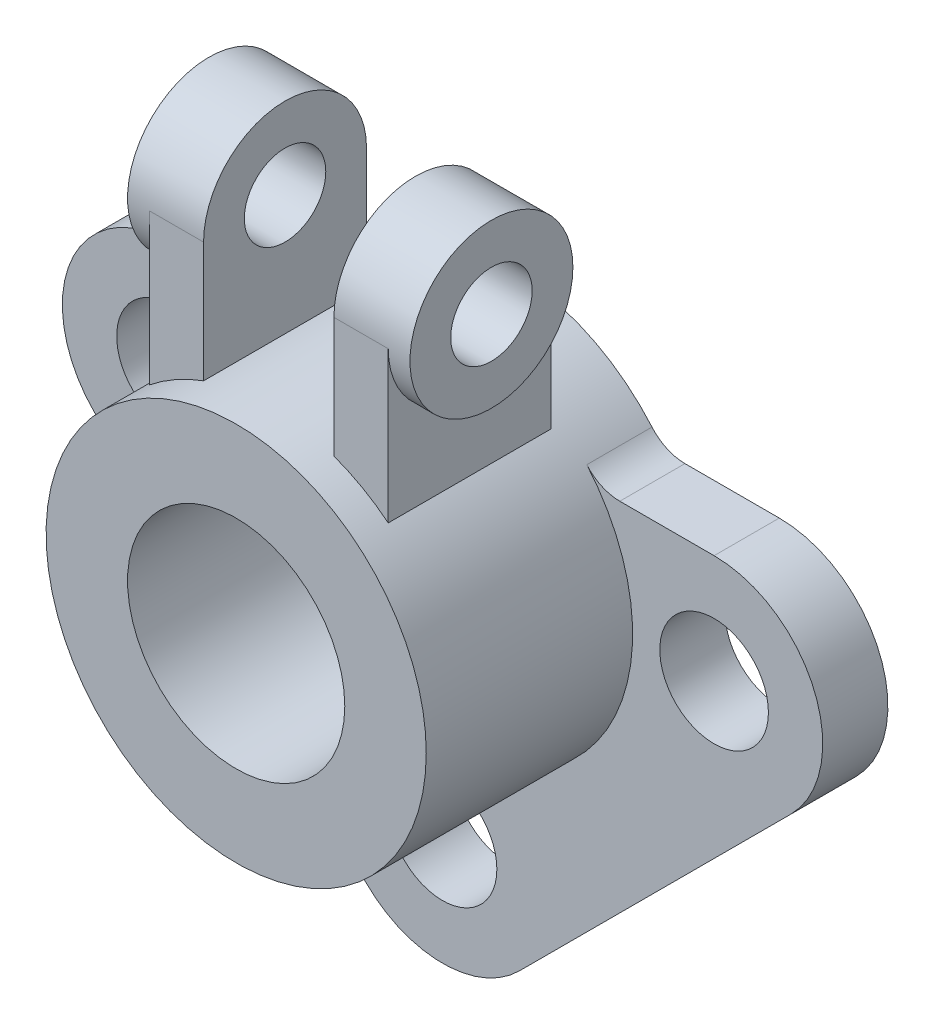
ISO-10303-21;
HEADER;
FILE_DESCRIPTION(('STEP AP214'),'2;1');
FILE_NAME('part.step','',(''),(''),'','','');
FILE_SCHEMA(('AUTOMOTIVE_DESIGN { 1 0 10303 214 1 1 1 1 }'));
ENDSEC;
DATA;
#1=APPLICATION_CONTEXT('core data for automotive mechanical design processes');
#2=APPLICATION_PROTOCOL_DEFINITION('international standard','automotive_design',2000,#1);
#3=PRODUCT_CONTEXT('',#1,'mechanical');
#4=PRODUCT('Part','Part','',(#3));
#5=PRODUCT_RELATED_PRODUCT_CATEGORY('part','',(#4));
#6=PRODUCT_DEFINITION_FORMATION('','',#4);
#7=PRODUCT_DEFINITION_CONTEXT('part definition',#1,'design');
#8=PRODUCT_DEFINITION('design','',#6,#7);
#9=PRODUCT_DEFINITION_SHAPE('','',#8);
#10=(LENGTH_UNIT() NAMED_UNIT(*) SI_UNIT(.MILLI.,.METRE.));
#11=(NAMED_UNIT(*) PLANE_ANGLE_UNIT() SI_UNIT($,.RADIAN.));
#12=(NAMED_UNIT(*) SI_UNIT($,.STERADIAN.) SOLID_ANGLE_UNIT());
#13=UNCERTAINTY_MEASURE_WITH_UNIT(LENGTH_MEASURE(1.E-05),#10,'distance_accuracy_value','');
#14=(GEOMETRIC_REPRESENTATION_CONTEXT(3) GLOBAL_UNCERTAINTY_ASSIGNED_CONTEXT((#13)) GLOBAL_UNIT_ASSIGNED_CONTEXT((#10,
#11,#12)) REPRESENTATION_CONTEXT('',''));
#15=CARTESIAN_POINT('',(0.,0.,0.));
#16=DIRECTION('',(0.,0.,1.));
#17=DIRECTION('',(1.,0.,0.));
#18=AXIS2_PLACEMENT_3D('',#15,#16,#17);
#19=CARTESIAN_POINT('',(0.,0.,50.));
#20=DIRECTION('',(0.,0.,-1.));
#21=DIRECTION('',(-1.,0.,0.));
#22=AXIS2_PLACEMENT_3D('',#19,#20,#21);
#23=CYLINDRICAL_SURFACE('',#22,35.);
#24=CARTESIAN_POINT('',(0.,0.,50.));
#25=DIRECTION('',(0.,0.,1.));
#26=DIRECTION('',(1.,0.,0.));
#27=AXIS2_PLACEMENT_3D('',#24,#25,#26);
#28=CIRCLE('',#27,35.);
#29=CARTESIAN_POINT('',(35.,0.,50.));
#30=VERTEX_POINT('',#29);
#31=EDGE_CURVE('E265',#30,#30,#28,.T.);
#32=ORIENTED_EDGE('',*,*,#31,.F.);
#33=EDGE_LOOP('',(#32));
#34=FACE_BOUND('',#33,.T.);
#35=CARTESIAN_POINT('',(0.,0.,0.));
#36=DIRECTION('',(0.,0.,1.));
#37=DIRECTION('',(1.,0.,0.));
#38=AXIS2_PLACEMENT_3D('',#35,#36,#37);
#39=CIRCLE('',#38,35.);
#40=CARTESIAN_POINT('',(26.5628330475733,22.7906976744186,0.));
#41=VERTEX_POINT('',#40);
#42=CARTESIAN_POINT('',(-26.5628330475733,22.7906976744186,0.));
#43=VERTEX_POINT('',#42);
#44=EDGE_CURVE('E266',#41,#43,#39,.T.);
#45=ORIENTED_EDGE('',*,*,#44,.T.);
#46=DIRECTION('',(0.,0.,-1.));
#47=VECTOR('',#46,1.);
#48=CARTESIAN_POINT('',(-26.5628330475733,22.7906976744186,50.));
#49=LINE('',#48,#47);
#50=CARTESIAN_POINT('',(-26.5628330475733,22.7906976744186,12.));
#51=VERTEX_POINT('',#50);
#52=EDGE_CURVE('E398',#43,#51,#49,.F.);
#53=ORIENTED_EDGE('',*,*,#52,.T.);
#54=CARTESIAN_POINT('',(0.,0.,12.));
#55=DIRECTION('',(0.,0.,1.));
#56=DIRECTION('',(1.,0.,0.));
#57=AXIS2_PLACEMENT_3D('',#54,#55,#56);
#58=CIRCLE('',#57,35.);
#59=CARTESIAN_POINT('',(26.5628330475733,22.7906976744186,12.));
#60=VERTEX_POINT('',#59);
#61=EDGE_CURVE('E297',#51,#60,#58,.T.);
#62=ORIENTED_EDGE('',*,*,#61,.T.);
#63=DIRECTION('',(0.,0.,-1.));
#64=VECTOR('',#63,1.);
#65=CARTESIAN_POINT('',(26.5628330475733,22.7906976744186,50.));
#66=LINE('',#65,#64);
#67=EDGE_CURVE('E394',#60,#41,#66,.T.);
#68=ORIENTED_EDGE('',*,*,#67,.T.);
#69=EDGE_LOOP('',(#45,#53,#62,#68));
#70=FACE_BOUND('',#69,.T.);
#71=CARTESIAN_POINT('',(0.,0.,14.));
#72=DIRECTION('',(0.,0.,1.));
#73=DIRECTION('',(1.,0.,0.));
#74=AXIS2_PLACEMENT_3D('',#71,#72,#73);
#75=CIRCLE('',#74,35.);
#76=CARTESIAN_POINT('',(22.,27.2213151776324,14.));
#77=VERTEX_POINT('',#76);
#78=CARTESIAN_POINT('',(12.,32.8785644455472,14.));
#79=VERTEX_POINT('',#78);
#80=EDGE_CURVE('E379',#77,#79,#75,.T.);
#81=ORIENTED_EDGE('',*,*,#80,.F.);
#82=DIRECTION('',(0.,0.,-1.));
#83=VECTOR('',#82,1.);
#84=CARTESIAN_POINT('',(22.,27.2213151776324,50.));
#85=LINE('',#84,#83);
#86=CARTESIAN_POINT('',(22.,27.2213151776324,44.));
#87=VERTEX_POINT('',#86);
#88=EDGE_CURVE('E387',#77,#87,#85,.F.);
#89=ORIENTED_EDGE('',*,*,#88,.T.);
#90=CARTESIAN_POINT('',(0.,0.,44.));
#91=DIRECTION('',(0.,0.,-1.));
#92=DIRECTION('',(-1.,0.,0.));
#93=AXIS2_PLACEMENT_3D('',#90,#91,#92);
#94=CIRCLE('',#93,35.);
#95=CARTESIAN_POINT('',(12.,32.8785644455472,44.));
#96=VERTEX_POINT('',#95);
#97=EDGE_CURVE('E383',#96,#87,#94,.T.);
#98=ORIENTED_EDGE('',*,*,#97,.F.);
#99=DIRECTION('',(0.,0.,-1.));
#100=VECTOR('',#99,1.);
#101=CARTESIAN_POINT('',(12.,32.8785644455472,50.));
#102=LINE('',#101,#100);
#103=EDGE_CURVE('E375',#79,#96,#102,.F.);
#104=ORIENTED_EDGE('',*,*,#103,.F.);
#105=EDGE_LOOP('',(#81,#89,#98,#104));
#106=FACE_BOUND('',#105,.T.);
#107=CARTESIAN_POINT('',(0.,0.,44.));
#108=DIRECTION('',(0.,0.,1.));
#109=DIRECTION('',(1.,0.,0.));
#110=AXIS2_PLACEMENT_3D('',#107,#108,#109);
#111=CIRCLE('',#110,35.);
#112=CARTESIAN_POINT('',(-12.,32.8785644455472,44.));
#113=VERTEX_POINT('',#112);
#114=CARTESIAN_POINT('',(-22.,27.2213151776324,44.));
#115=VERTEX_POINT('',#114);
#116=EDGE_CURVE('E211',#113,#115,#111,.T.);
#117=ORIENTED_EDGE('',*,*,#116,.T.);
#118=DIRECTION('',(0.,0.,-1.));
#119=VECTOR('',#118,1.);
#120=CARTESIAN_POINT('',(-22.,27.2213151776324,50.));
#121=LINE('',#120,#119);
#122=CARTESIAN_POINT('',(-22.,27.2213151776324,14.));
#123=VERTEX_POINT('',#122);
#124=EDGE_CURVE('E214',#123,#115,#121,.F.);
#125=ORIENTED_EDGE('',*,*,#124,.F.);
#126=CARTESIAN_POINT('',(0.,0.,14.));
#127=DIRECTION('',(0.,0.,-1.));
#128=DIRECTION('',(-1.,0.,0.));
#129=AXIS2_PLACEMENT_3D('',#126,#127,#128);
#130=CIRCLE('',#129,35.);
#131=CARTESIAN_POINT('',(-12.,32.8785644455472,14.));
#132=VERTEX_POINT('',#131);
#133=EDGE_CURVE('E208',#123,#132,#130,.T.);
#134=ORIENTED_EDGE('',*,*,#133,.T.);
#135=DIRECTION('',(0.,0.,-1.));
#136=VECTOR('',#135,1.);
#137=CARTESIAN_POINT('',(-12.,32.8785644455472,50.));
#138=LINE('',#137,#136);
#139=EDGE_CURVE('E192',#132,#113,#138,.F.);
#140=ORIENTED_EDGE('',*,*,#139,.T.);
#141=EDGE_LOOP('',(#117,#125,#134,#140));
#142=FACE_BOUND('',#141,.T.);
#143=ADVANCED_FACE('F40',(#34,#70,#106,#142),#23,.T.);
#144=CARTESIAN_POINT('',(0.,-50.,12.));
#145=DIRECTION('',(0.,0.,-1.));
#146=DIRECTION('',(-1.,0.,0.));
#147=AXIS2_PLACEMENT_3D('',#144,#145,#146);
#148=CYLINDRICAL_SURFACE('',#147,20.);
#149=CARTESIAN_POINT('',(0.,-50.,0.));
#150=DIRECTION('',(0.,0.,1.));
#151=DIRECTION('',(1.,0.,0.));
#152=AXIS2_PLACEMENT_3D('',#149,#150,#151);
#153=CIRCLE('',#152,20.);
#154=CARTESIAN_POINT('',(14.142135623731,-64.142135623731,0.));
#155=VERTEX_POINT('',#154);
#156=CARTESIAN_POINT('',(-14.142135623731,-64.142135623731,0.));
#157=VERTEX_POINT('',#156);
#158=EDGE_CURVE('E322',#155,#157,#153,.F.);
#159=ORIENTED_EDGE('',*,*,#158,.F.);
#160=DIRECTION('',(0.,0.,-1.));
#161=VECTOR('',#160,1.);
#162=CARTESIAN_POINT('',(14.142135623731,-64.142135623731,12.));
#163=LINE('',#162,#161);
#164=CARTESIAN_POINT('',(14.142135623731,-64.142135623731,12.));
#165=VERTEX_POINT('',#164);
#166=EDGE_CURVE('E372',#165,#155,#163,.T.);
#167=ORIENTED_EDGE('',*,*,#166,.F.);
#168=CARTESIAN_POINT('',(0.,-50.,12.));
#169=DIRECTION('',(0.,0.,1.));
#170=DIRECTION('',(1.,0.,0.));
#171=AXIS2_PLACEMENT_3D('',#168,#169,#170);
#172=CIRCLE('',#171,20.);
#173=CARTESIAN_POINT('',(-14.142135623731,-64.142135623731,12.));
#174=VERTEX_POINT('',#173);
#175=EDGE_CURVE('E281',#165,#174,#172,.F.);
#176=ORIENTED_EDGE('',*,*,#175,.T.);
#177=DIRECTION('',(0.,0.,-1.));
#178=VECTOR('',#177,1.);
#179=CARTESIAN_POINT('',(-14.142135623731,-64.142135623731,12.));
#180=LINE('',#179,#178);
#181=EDGE_CURVE('E318',#174,#157,#180,.T.);
#182=ORIENTED_EDGE('',*,*,#181,.T.);
#183=EDGE_LOOP('',(#159,#167,#176,#182));
#184=FACE_BOUND('',#183,.T.);
#185=ADVANCED_FACE('F451',(#184),#148,.T.);
#186=CARTESIAN_POINT('',(39.142135623731,-39.1421356237309,12.));
#187=DIRECTION('',(0.707106781186548,-0.707106781186547,0.));
#188=DIRECTION('',(0.707106781186547,0.707106781186548,0.));
#189=AXIS2_PLACEMENT_3D('',#186,#187,#188);
#190=PLANE('',#189);
#191=DIRECTION('',(-0.707106781186547,-0.707106781186548,0.));
#192=VECTOR('',#191,1.);
#193=CARTESIAN_POINT('',(39.142135623731,-39.1421356237309,0.));
#194=LINE('',#193,#192);
#195=CARTESIAN_POINT('',(64.1421356237309,-14.1421356237309,0.));
#196=VERTEX_POINT('',#195);
#197=EDGE_CURVE('E326',#196,#155,#194,.T.);
#198=ORIENTED_EDGE('',*,*,#197,.F.);
#199=DIRECTION('',(0.,0.,-1.));
#200=VECTOR('',#199,1.);
#201=CARTESIAN_POINT('',(64.1421356237309,-14.1421356237309,12.));
#202=LINE('',#201,#200);
#203=CARTESIAN_POINT('',(64.1421356237309,-14.1421356237309,12.));
#204=VERTEX_POINT('',#203);
#205=EDGE_CURVE('E369',#204,#196,#202,.T.);
#206=ORIENTED_EDGE('',*,*,#205,.F.);
#207=DIRECTION('',(-0.707106781186547,-0.707106781186548,0.));
#208=VECTOR('',#207,1.);
#209=CARTESIAN_POINT('',(39.142135623731,-39.1421356237309,12.));
#210=LINE('',#209,#208);
#211=EDGE_CURVE('E286',#204,#165,#210,.T.);
#212=ORIENTED_EDGE('',*,*,#211,.T.);
#213=ORIENTED_EDGE('',*,*,#166,.T.);
#214=EDGE_LOOP('',(#198,#206,#212,#213));
#215=FACE_BOUND('',#214,.T.);
#216=ADVANCED_FACE('F459',(#215),#190,.T.);
#217=CARTESIAN_POINT('',(50.,0.,12.));
#218=DIRECTION('',(0.,0.,-1.));
#219=DIRECTION('',(-1.,0.,0.));
#220=AXIS2_PLACEMENT_3D('',#217,#218,#219);
#221=CYLINDRICAL_SURFACE('',#220,20.);
#222=CARTESIAN_POINT('',(50.,0.,0.));
#223=DIRECTION('',(0.,0.,1.));
#224=DIRECTION('',(1.,0.,0.));
#225=AXIS2_PLACEMENT_3D('',#222,#223,#224);
#226=CIRCLE('',#225,20.);
#227=CARTESIAN_POINT('',(50.,20.,0.));
#228=VERTEX_POINT('',#227);
#229=EDGE_CURVE('E330',#228,#196,#226,.F.);
#230=ORIENTED_EDGE('',*,*,#229,.F.);
#231=DIRECTION('',(0.,0.,-1.));
#232=VECTOR('',#231,1.);
#233=CARTESIAN_POINT('',(50.,20.,12.));
#234=LINE('',#233,#232);
#235=CARTESIAN_POINT('',(50.,20.,12.));
#236=VERTEX_POINT('',#235);
#237=EDGE_CURVE('E365',#236,#228,#234,.T.);
#238=ORIENTED_EDGE('',*,*,#237,.F.);
#239=CARTESIAN_POINT('',(50.,0.,12.));
#240=DIRECTION('',(0.,0.,1.));
#241=DIRECTION('',(1.,0.,0.));
#242=AXIS2_PLACEMENT_3D('',#239,#240,#241);
#243=CIRCLE('',#242,20.);
#244=EDGE_CURVE('E290',#236,#204,#243,.F.);
#245=ORIENTED_EDGE('',*,*,#244,.T.);
#246=ORIENTED_EDGE('',*,*,#205,.T.);
#247=EDGE_LOOP('',(#230,#238,#245,#246));
#248=FACE_BOUND('',#247,.T.);
#249=ADVANCED_FACE('F503',(#248),#221,.T.);
#250=CARTESIAN_POINT('',(0.,20.,12.));
#251=DIRECTION('',(0.,1.,0.));
#252=DIRECTION('',(0.,0.,1.));
#253=AXIS2_PLACEMENT_3D('',#250,#251,#252);
#254=PLANE('',#253);
#255=DIRECTION('',(1.,0.,0.));
#256=VECTOR('',#255,1.);
#257=CARTESIAN_POINT('',(0.,20.,0.));
#258=LINE('',#257,#256);
#259=CARTESIAN_POINT('',(32.6343377441614,20.,0.));
#260=VERTEX_POINT('',#259);
#261=EDGE_CURVE('E334',#260,#228,#258,.T.);
#262=ORIENTED_EDGE('',*,*,#261,.F.);
#263=DIRECTION('',(0.,0.,-1.));
#264=VECTOR('',#263,1.);
#265=CARTESIAN_POINT('',(32.6343377441614,20.,12.));
#266=LINE('',#265,#264);
#267=CARTESIAN_POINT('',(32.6343377441614,20.,12.));
#268=VERTEX_POINT('',#267);
#269=EDGE_CURVE('E56',#260,#268,#266,.F.);
#270=ORIENTED_EDGE('',*,*,#269,.T.);
#271=DIRECTION('',(1.,0.,0.));
#272=VECTOR('',#271,1.);
#273=CARTESIAN_POINT('',(0.,20.,12.));
#274=LINE('',#273,#272);
#275=EDGE_CURVE('E294',#268,#236,#274,.T.);
#276=ORIENTED_EDGE('',*,*,#275,.T.);
#277=ORIENTED_EDGE('',*,*,#237,.T.);
#278=EDGE_LOOP('',(#262,#270,#276,#277));
#279=FACE_BOUND('',#278,.T.);
#280=ADVANCED_FACE('F500',(#279),#254,.T.);
#281=CARTESIAN_POINT('',(0.,20.,12.));
#282=DIRECTION('',(0.,-1.,0.));
#283=DIRECTION('',(1.,0.,0.));
#284=AXIS2_PLACEMENT_3D('',#281,#282,#283);
#285=PLANE('',#284);
#286=DIRECTION('',(-1.,0.,0.));
#287=VECTOR('',#286,1.);
#288=CARTESIAN_POINT('',(0.,20.,12.));
#289=LINE('',#288,#287);
#290=CARTESIAN_POINT('',(-32.6343377441614,20.,12.));
#291=VERTEX_POINT('',#290);
#292=CARTESIAN_POINT('',(-50.,20.,12.));
#293=VERTEX_POINT('',#292);
#294=EDGE_CURVE('E300',#291,#293,#289,.T.);
#295=ORIENTED_EDGE('',*,*,#294,.F.);
#296=DIRECTION('',(0.,0.,1.));
#297=VECTOR('',#296,1.);
#298=CARTESIAN_POINT('',(-32.6343377441614,20.,0.));
#299=LINE('',#298,#297);
#300=CARTESIAN_POINT('',(-32.6343377441614,20.,0.));
#301=VERTEX_POINT('',#300);
#302=EDGE_CURVE('E390',#291,#301,#299,.F.);
#303=ORIENTED_EDGE('',*,*,#302,.T.);
#304=DIRECTION('',(-1.,0.,0.));
#305=VECTOR('',#304,1.);
#306=CARTESIAN_POINT('',(0.,20.,0.));
#307=LINE('',#306,#305);
#308=CARTESIAN_POINT('',(-50.,20.,0.));
#309=VERTEX_POINT('',#308);
#310=EDGE_CURVE('E337',#301,#309,#307,.T.);
#311=ORIENTED_EDGE('',*,*,#310,.T.);
#312=DIRECTION('',(0.,0.,-1.));
#313=VECTOR('',#312,1.);
#314=CARTESIAN_POINT('',(-50.,20.,12.));
#315=LINE('',#314,#313);
#316=EDGE_CURVE('E361',#293,#309,#315,.T.);
#317=ORIENTED_EDGE('',*,*,#316,.F.);
#318=EDGE_LOOP('',(#295,#303,#311,#317));
#319=FACE_BOUND('',#318,.T.);
#320=ADVANCED_FACE('F496',(#319),#285,.F.);
#321=CARTESIAN_POINT('',(-50.,0.,12.));
#322=DIRECTION('',(0.,0.,-1.));
#323=DIRECTION('',(-1.,0.,0.));
#324=AXIS2_PLACEMENT_3D('',#321,#322,#323);
#325=CYLINDRICAL_SURFACE('',#324,20.);
#326=CARTESIAN_POINT('',(-50.,0.,0.));
#327=DIRECTION('',(0.,0.,1.));
#328=DIRECTION('',(1.,0.,0.));
#329=AXIS2_PLACEMENT_3D('',#326,#327,#328);
#330=CIRCLE('',#329,20.);
#331=CARTESIAN_POINT('',(-64.1421356237309,-14.1421356237309,0.));
#332=VERTEX_POINT('',#331);
#333=EDGE_CURVE('E340',#309,#332,#330,.T.);
#334=ORIENTED_EDGE('',*,*,#333,.T.);
#335=DIRECTION('',(0.,0.,-1.));
#336=VECTOR('',#335,1.);
#337=CARTESIAN_POINT('',(-64.1421356237309,-14.1421356237309,12.));
#338=LINE('',#337,#336);
#339=CARTESIAN_POINT('',(-64.1421356237309,-14.1421356237309,12.));
#340=VERTEX_POINT('',#339);
#341=EDGE_CURVE('E357',#340,#332,#338,.T.);
#342=ORIENTED_EDGE('',*,*,#341,.F.);
#343=CARTESIAN_POINT('',(-50.,0.,12.));
#344=DIRECTION('',(0.,0.,1.));
#345=DIRECTION('',(1.,0.,0.));
#346=AXIS2_PLACEMENT_3D('',#343,#344,#345);
#347=CIRCLE('',#346,20.);
#348=EDGE_CURVE('E303',#293,#340,#347,.T.);
#349=ORIENTED_EDGE('',*,*,#348,.F.);
#350=ORIENTED_EDGE('',*,*,#316,.T.);
#351=EDGE_LOOP('',(#334,#342,#349,#350));
#352=FACE_BOUND('',#351,.T.);
#353=ADVANCED_FACE('F489',(#352),#325,.T.);
#354=CARTESIAN_POINT('',(50.,0.,12.));
#355=DIRECTION('',(0.,0.,-1.));
#356=DIRECTION('',(-1.,0.,0.));
#357=AXIS2_PLACEMENT_3D('',#354,#355,#356);
#358=CYLINDRICAL_SURFACE('',#357,10.);
#359=CARTESIAN_POINT('',(50.,0.,12.));
#360=DIRECTION('',(0.,0.,1.));
#361=DIRECTION('',(1.,0.,0.));
#362=AXIS2_PLACEMENT_3D('',#359,#360,#361);
#363=CIRCLE('',#362,10.);
#364=CARTESIAN_POINT('',(60.,0.,12.));
#365=VERTEX_POINT('',#364);
#366=EDGE_CURVE('E310',#365,#365,#363,.T.);
#367=ORIENTED_EDGE('',*,*,#366,.T.);
#368=EDGE_LOOP('',(#367));
#369=FACE_BOUND('',#368,.T.);
#370=CARTESIAN_POINT('',(50.,0.,0.));
#371=DIRECTION('',(0.,0.,1.));
#372=DIRECTION('',(1.,0.,0.));
#373=AXIS2_PLACEMENT_3D('',#370,#371,#372);
#374=CIRCLE('',#373,10.);
#375=CARTESIAN_POINT('',(60.,0.,0.));
#376=VERTEX_POINT('',#375);
#377=EDGE_CURVE('E348',#376,#376,#374,.T.);
#378=ORIENTED_EDGE('',*,*,#377,.F.);
#379=EDGE_LOOP('',(#378));
#380=FACE_BOUND('',#379,.T.);
#381=ADVANCED_FACE('F485',(#369,#380),#358,.F.);
#382=CARTESIAN_POINT('',(-39.142135623731,-39.1421356237309,12.));
#383=DIRECTION('',(0.707106781186548,0.707106781186547,0.));
#384=DIRECTION('',(-0.707106781186547,0.707106781186548,0.));
#385=AXIS2_PLACEMENT_3D('',#382,#383,#384);
#386=PLANE('',#385);
#387=DIRECTION('',(0.707106781186547,-0.707106781186548,0.));
#388=VECTOR('',#387,1.);
#389=CARTESIAN_POINT('',(-39.142135623731,-39.1421356237309,0.));
#390=LINE('',#389,#388);
#391=EDGE_CURVE('E344',#332,#157,#390,.T.);
#392=ORIENTED_EDGE('',*,*,#391,.T.);
#393=ORIENTED_EDGE('',*,*,#181,.F.);
#394=DIRECTION('',(0.707106781186547,-0.707106781186548,0.));
#395=VECTOR('',#394,1.);
#396=CARTESIAN_POINT('',(-39.142135623731,-39.1421356237309,12.));
#397=LINE('',#396,#395);
#398=EDGE_CURVE('E307',#340,#174,#397,.T.);
#399=ORIENTED_EDGE('',*,*,#398,.F.);
#400=ORIENTED_EDGE('',*,*,#341,.T.);
#401=EDGE_LOOP('',(#392,#393,#399,#400));
#402=FACE_BOUND('',#401,.T.);
#403=ADVANCED_FACE('F488',(#402),#386,.F.);
#404=CARTESIAN_POINT('',(0.,-50.,12.));
#405=DIRECTION('',(0.,0.,-1.));
#406=DIRECTION('',(-1.,0.,0.));
#407=AXIS2_PLACEMENT_3D('',#404,#405,#406);
#408=CYLINDRICAL_SURFACE('',#407,10.);
#409=CARTESIAN_POINT('',(0.,-50.,12.));
#410=DIRECTION('',(0.,0.,1.));
#411=DIRECTION('',(1.,0.,0.));
#412=AXIS2_PLACEMENT_3D('',#409,#410,#411);
#413=CIRCLE('',#412,10.);
#414=CARTESIAN_POINT('',(10.,-50.,12.));
#415=VERTEX_POINT('',#414);
#416=EDGE_CURVE('E277',#415,#415,#413,.T.);
#417=ORIENTED_EDGE('',*,*,#416,.T.);
#418=EDGE_LOOP('',(#417));
#419=FACE_BOUND('',#418,.T.);
#420=CARTESIAN_POINT('',(0.,-50.,0.));
#421=DIRECTION('',(0.,0.,1.));
#422=DIRECTION('',(1.,0.,0.));
#423=AXIS2_PLACEMENT_3D('',#420,#421,#422);
#424=CIRCLE('',#423,10.);
#425=CARTESIAN_POINT('',(10.,-50.,0.));
#426=VERTEX_POINT('',#425);
#427=EDGE_CURVE('E270',#426,#426,#424,.T.);
#428=ORIENTED_EDGE('',*,*,#427,.F.);
#429=EDGE_LOOP('',(#428));
#430=FACE_BOUND('',#429,.T.);
#431=ADVANCED_FACE('F483',(#419,#430),#408,.F.);
#432=CARTESIAN_POINT('',(-50.,0.,12.));
#433=DIRECTION('',(0.,0.,-1.));
#434=DIRECTION('',(-1.,0.,0.));
#435=AXIS2_PLACEMENT_3D('',#432,#433,#434);
#436=CYLINDRICAL_SURFACE('',#435,10.);
#437=CARTESIAN_POINT('',(-50.,0.,12.));
#438=DIRECTION('',(0.,0.,1.));
#439=DIRECTION('',(1.,0.,0.));
#440=AXIS2_PLACEMENT_3D('',#437,#438,#439);
#441=CIRCLE('',#440,10.);
#442=CARTESIAN_POINT('',(-40.,0.,12.));
#443=VERTEX_POINT('',#442);
#444=EDGE_CURVE('E314',#443,#443,#441,.F.);
#445=ORIENTED_EDGE('',*,*,#444,.F.);
#446=EDGE_LOOP('',(#445));
#447=FACE_BOUND('',#446,.T.);
#448=CARTESIAN_POINT('',(-50.,0.,0.));
#449=DIRECTION('',(0.,0.,1.));
#450=DIRECTION('',(1.,0.,0.));
#451=AXIS2_PLACEMENT_3D('',#448,#449,#450);
#452=CIRCLE('',#451,10.);
#453=CARTESIAN_POINT('',(-40.,0.,0.));
#454=VERTEX_POINT('',#453);
#455=EDGE_CURVE('E282',#454,#454,#452,.F.);
#456=ORIENTED_EDGE('',*,*,#455,.T.);
#457=EDGE_LOOP('',(#456));
#458=FACE_BOUND('',#457,.T.);
#459=ADVANCED_FACE('F476',(#447,#458),#436,.F.);
#460=CARTESIAN_POINT('',(0.,0.,12.));
#461=DIRECTION('',(0.,0.,1.));
#462=DIRECTION('',(1.,0.,0.));
#463=AXIS2_PLACEMENT_3D('',#460,#461,#462);
#464=PLANE('',#463);
#465=ORIENTED_EDGE('',*,*,#416,.F.);
#466=EDGE_LOOP('',(#465));
#467=FACE_BOUND('',#466,.T.);
#468=ORIENTED_EDGE('',*,*,#175,.F.);
#469=ORIENTED_EDGE('',*,*,#211,.F.);
#470=ORIENTED_EDGE('',*,*,#244,.F.);
#471=ORIENTED_EDGE('',*,*,#275,.F.);
#472=CARTESIAN_POINT('',(32.6343377441614,28.,12.));
#473=DIRECTION('',(0.,0.,1.));
#474=DIRECTION('',(1.,0.,0.));
#475=AXIS2_PLACEMENT_3D('',#472,#473,#474);
#476=CIRCLE('',#475,8.);
#477=EDGE_CURVE('E11',#268,#60,#476,.F.);
#478=ORIENTED_EDGE('',*,*,#477,.T.);
#479=ORIENTED_EDGE('',*,*,#61,.F.);
#480=CARTESIAN_POINT('',(-32.6343377441614,28.,12.));
#481=DIRECTION('',(0.,0.,1.));
#482=DIRECTION('',(1.,0.,0.));
#483=AXIS2_PLACEMENT_3D('',#480,#481,#482);
#484=CIRCLE('',#483,8.);
#485=EDGE_CURVE('E407',#51,#291,#484,.F.);
#486=ORIENTED_EDGE('',*,*,#485,.T.);
#487=ORIENTED_EDGE('',*,*,#294,.T.);
#488=ORIENTED_EDGE('',*,*,#348,.T.);
#489=ORIENTED_EDGE('',*,*,#398,.T.);
#490=EDGE_LOOP('',(#468,#469,#470,#471,#478,#479,#486,#487,#488,#489));
#491=FACE_BOUND('',#490,.T.);
#492=ORIENTED_EDGE('',*,*,#366,.F.);
#493=EDGE_LOOP('',(#492));
#494=FACE_BOUND('',#493,.T.);
#495=ORIENTED_EDGE('',*,*,#444,.T.);
#496=EDGE_LOOP('',(#495));
#497=FACE_BOUND('',#496,.T.);
#498=ADVANCED_FACE('F473',(#467,#491,#494,#497),#464,.T.);
#499=CARTESIAN_POINT('',(0.,0.,0.));
#500=DIRECTION('',(0.,0.,1.));
#501=DIRECTION('',(1.,0.,0.));
#502=AXIS2_PLACEMENT_3D('',#499,#500,#501);
#503=PLANE('',#502);
#504=ORIENTED_EDGE('',*,*,#427,.T.);
#505=EDGE_LOOP('',(#504));
#506=FACE_BOUND('',#505,.T.);
#507=ORIENTED_EDGE('',*,*,#158,.T.);
#508=ORIENTED_EDGE('',*,*,#391,.F.);
#509=ORIENTED_EDGE('',*,*,#333,.F.);
#510=ORIENTED_EDGE('',*,*,#310,.F.);
#511=CARTESIAN_POINT('',(-32.6343377441614,28.,0.));
#512=DIRECTION('',(0.,0.,1.));
#513=DIRECTION('',(1.,0.,0.));
#514=AXIS2_PLACEMENT_3D('',#511,#512,#513);
#515=CIRCLE('',#514,8.);
#516=EDGE_CURVE('E404',#301,#43,#515,.T.);
#517=ORIENTED_EDGE('',*,*,#516,.T.);
#518=ORIENTED_EDGE('',*,*,#44,.F.);
#519=CARTESIAN_POINT('',(32.6343377441614,28.,0.));
#520=DIRECTION('',(0.,0.,1.));
#521=DIRECTION('',(1.,0.,0.));
#522=AXIS2_PLACEMENT_3D('',#519,#520,#521);
#523=CIRCLE('',#522,8.);
#524=EDGE_CURVE('E49',#41,#260,#523,.T.);
#525=ORIENTED_EDGE('',*,*,#524,.T.);
#526=ORIENTED_EDGE('',*,*,#261,.T.);
#527=ORIENTED_EDGE('',*,*,#229,.T.);
#528=ORIENTED_EDGE('',*,*,#197,.T.);
#529=EDGE_LOOP('',(#507,#508,#509,#510,#517,#518,#525,#526,#527,#528));
#530=FACE_BOUND('',#529,.T.);
#531=ORIENTED_EDGE('',*,*,#377,.T.);
#532=EDGE_LOOP('',(#531));
#533=FACE_BOUND('',#532,.T.);
#534=ORIENTED_EDGE('',*,*,#455,.F.);
#535=EDGE_LOOP('',(#534));
#536=FACE_BOUND('',#535,.T.);
#537=CARTESIAN_POINT('',(0.,0.,0.));
#538=DIRECTION('',(0.,0.,1.));
#539=DIRECTION('',(1.,0.,0.));
#540=AXIS2_PLACEMENT_3D('',#537,#538,#539);
#541=CIRCLE('',#540,20.);
#542=CARTESIAN_POINT('',(20.,0.,0.));
#543=VERTEX_POINT('',#542);
#544=EDGE_CURVE('E260',#543,#543,#541,.T.);
#545=ORIENTED_EDGE('',*,*,#544,.T.);
#546=EDGE_LOOP('',(#545));
#547=FACE_BOUND('',#546,.T.);
#548=ADVANCED_FACE('F471',(#506,#530,#533,#536,#547),#503,.F.);
#549=CARTESIAN_POINT('',(0.,0.,50.));
#550=DIRECTION('',(0.,0.,-1.));
#551=DIRECTION('',(-1.,0.,0.));
#552=AXIS2_PLACEMENT_3D('',#549,#550,#551);
#553=CYLINDRICAL_SURFACE('',#552,20.);
#554=CARTESIAN_POINT('',(0.,0.,50.));
#555=DIRECTION('',(0.,0.,1.));
#556=DIRECTION('',(1.,0.,0.));
#557=AXIS2_PLACEMENT_3D('',#554,#555,#556);
#558=CIRCLE('',#557,20.);
#559=CARTESIAN_POINT('',(20.,0.,50.));
#560=VERTEX_POINT('',#559);
#561=EDGE_CURVE('E261',#560,#560,#558,.T.);
#562=ORIENTED_EDGE('',*,*,#561,.T.);
#563=EDGE_LOOP('',(#562));
#564=FACE_BOUND('',#563,.T.);
#565=ORIENTED_EDGE('',*,*,#544,.F.);
#566=EDGE_LOOP('',(#565));
#567=FACE_BOUND('',#566,.T.);
#568=ADVANCED_FACE('F468',(#564,#567),#553,.F.);
#569=CARTESIAN_POINT('',(0.,0.,50.));
#570=DIRECTION('',(0.,0.,1.));
#571=DIRECTION('',(1.,0.,0.));
#572=AXIS2_PLACEMENT_3D('',#569,#570,#571);
#573=PLANE('',#572);
#574=ORIENTED_EDGE('',*,*,#561,.F.);
#575=EDGE_LOOP('',(#574));
#576=FACE_BOUND('',#575,.T.);
#577=ORIENTED_EDGE('',*,*,#31,.T.);
#578=EDGE_LOOP('',(#577));
#579=FACE_BOUND('',#578,.T.);
#580=ADVANCED_FACE('F466',(#576,#579),#573,.T.);
#581=CARTESIAN_POINT('',(22.,0.,0.));
#582=DIRECTION('',(1.,0.,0.));
#583=DIRECTION('',(0.,0.,-1.));
#584=AXIS2_PLACEMENT_3D('',#581,#582,#583);
#585=PLANE('',#584);
#586=CARTESIAN_POINT('',(22.,55.,29.));
#587=DIRECTION('',(1.,0.,0.));
#588=DIRECTION('',(0.,0.,-1.));
#589=AXIS2_PLACEMENT_3D('',#586,#587,#588);
#590=CIRCLE('',#589,15.);
#591=CARTESIAN_POINT('',(22.,55.,44.));
#592=VERTEX_POINT('',#591);
#593=CARTESIAN_POINT('',(22.,55.,14.));
#594=VERTEX_POINT('',#593);
#595=EDGE_CURVE('E234',#592,#594,#590,.T.);
#596=ORIENTED_EDGE('',*,*,#595,.F.);
#597=DIRECTION('',(0.,-1.,0.));
#598=VECTOR('',#597,1.);
#599=CARTESIAN_POINT('',(22.,0.,44.));
#600=LINE('',#599,#598);
#601=EDGE_CURVE('E239',#592,#87,#600,.T.);
#602=ORIENTED_EDGE('',*,*,#601,.T.);
#603=ORIENTED_EDGE('',*,*,#88,.F.);
#604=DIRECTION('',(0.,1.,0.));
#605=VECTOR('',#604,1.);
#606=CARTESIAN_POINT('',(22.,0.,14.));
#607=LINE('',#606,#605);
#608=EDGE_CURVE('E243',#77,#594,#607,.T.);
#609=ORIENTED_EDGE('',*,*,#608,.T.);
#610=EDGE_LOOP('',(#596,#602,#603,#609));
#611=FACE_BOUND('',#610,.T.);
#612=ADVANCED_FACE('F557',(#611),#585,.T.);
#613=CARTESIAN_POINT('',(12.,0.,0.));
#614=DIRECTION('',(1.,0.,0.));
#615=DIRECTION('',(0.,0.,-1.));
#616=AXIS2_PLACEMENT_3D('',#613,#614,#615);
#617=PLANE('',#616);
#618=CARTESIAN_POINT('',(12.,55.,29.));
#619=DIRECTION('',(1.,0.,0.));
#620=DIRECTION('',(0.,0.,-1.));
#621=AXIS2_PLACEMENT_3D('',#618,#619,#620);
#622=CIRCLE('',#621,7.5);
#623=CARTESIAN_POINT('',(12.,55.,21.5));
#624=VERTEX_POINT('',#623);
#625=EDGE_CURVE('E222',#624,#624,#622,.T.);
#626=ORIENTED_EDGE('',*,*,#625,.T.);
#627=EDGE_LOOP('',(#626));
#628=FACE_BOUND('',#627,.T.);
#629=DIRECTION('',(0.,-1.,0.));
#630=VECTOR('',#629,1.);
#631=CARTESIAN_POINT('',(12.,0.,44.));
#632=LINE('',#631,#630);
#633=CARTESIAN_POINT('',(12.,55.,44.));
#634=VERTEX_POINT('',#633);
#635=EDGE_CURVE('E238',#634,#96,#632,.T.);
#636=ORIENTED_EDGE('',*,*,#635,.F.);
#637=CARTESIAN_POINT('',(12.,55.,29.));
#638=DIRECTION('',(1.,0.,0.));
#639=DIRECTION('',(0.,0.,-1.));
#640=AXIS2_PLACEMENT_3D('',#637,#638,#639);
#641=CIRCLE('',#640,15.);
#642=CARTESIAN_POINT('',(12.,55.,14.));
#643=VERTEX_POINT('',#642);
#644=EDGE_CURVE('E230',#643,#634,#641,.T.);
#645=ORIENTED_EDGE('',*,*,#644,.F.);
#646=DIRECTION('',(0.,1.,0.));
#647=VECTOR('',#646,1.);
#648=CARTESIAN_POINT('',(12.,0.,14.));
#649=LINE('',#648,#647);
#650=EDGE_CURVE('E244',#79,#643,#649,.T.);
#651=ORIENTED_EDGE('',*,*,#650,.F.);
#652=ORIENTED_EDGE('',*,*,#103,.T.);
#653=EDGE_LOOP('',(#636,#645,#651,#652));
#654=FACE_BOUND('',#653,.T.);
#655=ADVANCED_FACE('F569',(#628,#654),#617,.F.);
#656=CARTESIAN_POINT('',(22.,0.,44.));
#657=DIRECTION('',(0.,0.,-1.));
#658=DIRECTION('',(-1.,0.,0.));
#659=AXIS2_PLACEMENT_3D('',#656,#657,#658);
#660=PLANE('',#659);
#661=ORIENTED_EDGE('',*,*,#635,.T.);
#662=ORIENTED_EDGE('',*,*,#97,.T.);
#663=ORIENTED_EDGE('',*,*,#601,.F.);
#664=DIRECTION('',(-1.,0.,0.));
#665=VECTOR('',#664,1.);
#666=CARTESIAN_POINT('',(22.,55.,44.));
#667=LINE('',#666,#665);
#668=EDGE_CURVE('E256',#592,#634,#667,.T.);
#669=ORIENTED_EDGE('',*,*,#668,.T.);
#670=EDGE_LOOP('',(#661,#662,#663,#669));
#671=FACE_BOUND('',#670,.T.);
#672=ADVANCED_FACE('F567',(#671),#660,.F.);
#673=CARTESIAN_POINT('',(22.,0.,14.));
#674=DIRECTION('',(0.,0.,1.));
#675=DIRECTION('',(1.,0.,0.));
#676=AXIS2_PLACEMENT_3D('',#673,#674,#675);
#677=PLANE('',#676);
#678=ORIENTED_EDGE('',*,*,#608,.F.);
#679=ORIENTED_EDGE('',*,*,#80,.T.);
#680=ORIENTED_EDGE('',*,*,#650,.T.);
#681=DIRECTION('',(-1.,0.,0.));
#682=VECTOR('',#681,1.);
#683=CARTESIAN_POINT('',(22.,55.,14.));
#684=LINE('',#683,#682);
#685=EDGE_CURVE('E247',#594,#643,#684,.T.);
#686=ORIENTED_EDGE('',*,*,#685,.F.);
#687=EDGE_LOOP('',(#678,#679,#680,#686));
#688=FACE_BOUND('',#687,.T.);
#689=ADVANCED_FACE('F560',(#688),#677,.F.);
#690=CARTESIAN_POINT('',(12.,55.,29.));
#691=DIRECTION('',(1.,0.,0.));
#692=DIRECTION('',(0.,0.,-1.));
#693=AXIS2_PLACEMENT_3D('',#690,#691,#692);
#694=CYLINDRICAL_SURFACE('',#693,15.);
#695=ORIENTED_EDGE('',*,*,#644,.T.);
#696=ORIENTED_EDGE('',*,*,#668,.F.);
#697=ORIENTED_EDGE('',*,*,#595,.T.);
#698=ORIENTED_EDGE('',*,*,#685,.T.);
#699=EDGE_LOOP('',(#695,#696,#697,#698));
#700=FACE_BOUND('',#699,.T.);
#701=CARTESIAN_POINT('',(26.,55.,29.));
#702=DIRECTION('',(1.,0.,0.));
#703=DIRECTION('',(0.,0.,-1.));
#704=AXIS2_PLACEMENT_3D('',#701,#702,#703);
#705=CIRCLE('',#704,15.);
#706=CARTESIAN_POINT('',(26.,55.,14.));
#707=VERTEX_POINT('',#706);
#708=EDGE_CURVE('E226',#707,#707,#705,.T.);
#709=ORIENTED_EDGE('',*,*,#708,.F.);
#710=EDGE_LOOP('',(#709));
#711=FACE_BOUND('',#710,.T.);
#712=ADVANCED_FACE('F564',(#700,#711),#694,.T.);
#713=CARTESIAN_POINT('',(26.,55.,29.));
#714=DIRECTION('',(1.,0.,0.));
#715=DIRECTION('',(0.,0.,-1.));
#716=AXIS2_PLACEMENT_3D('',#713,#714,#715);
#717=PLANE('',#716);
#718=CARTESIAN_POINT('',(26.,55.,29.));
#719=DIRECTION('',(1.,0.,0.));
#720=DIRECTION('',(0.,0.,-1.));
#721=AXIS2_PLACEMENT_3D('',#718,#719,#720);
#722=CIRCLE('',#721,7.5);
#723=CARTESIAN_POINT('',(26.,55.,21.5));
#724=VERTEX_POINT('',#723);
#725=EDGE_CURVE('E218',#724,#724,#722,.T.);
#726=ORIENTED_EDGE('',*,*,#725,.F.);
#727=EDGE_LOOP('',(#726));
#728=FACE_BOUND('',#727,.T.);
#729=ORIENTED_EDGE('',*,*,#708,.T.);
#730=EDGE_LOOP('',(#729));
#731=FACE_BOUND('',#730,.T.);
#732=ADVANCED_FACE('F584',(#728,#731),#717,.T.);
#733=CARTESIAN_POINT('',(-70.,55.,29.));
#734=DIRECTION('',(1.,0.,0.));
#735=DIRECTION('',(0.,0.,-1.));
#736=AXIS2_PLACEMENT_3D('',#733,#734,#735);
#737=CYLINDRICAL_SURFACE('',#736,7.5);
#738=ORIENTED_EDGE('',*,*,#725,.T.);
#739=EDGE_LOOP('',(#738));
#740=FACE_BOUND('',#739,.T.);
#741=ORIENTED_EDGE('',*,*,#625,.F.);
#742=EDGE_LOOP('',(#741));
#743=FACE_BOUND('',#742,.T.);
#744=ADVANCED_FACE('F446',(#740,#743),#737,.F.);
#745=CARTESIAN_POINT('',(-22.,0.,0.));
#746=DIRECTION('',(-1.,0.,0.));
#747=DIRECTION('',(0.,0.,-1.));
#748=AXIS2_PLACEMENT_3D('',#745,#746,#747);
#749=PLANE('',#748);
#750=CARTESIAN_POINT('',(-22.,55.,29.));
#751=DIRECTION('',(1.,0.,0.));
#752=DIRECTION('',(0.,0.,-1.));
#753=AXIS2_PLACEMENT_3D('',#750,#751,#752);
#754=CIRCLE('',#753,15.);
#755=CARTESIAN_POINT('',(-22.,55.,44.));
#756=VERTEX_POINT('',#755);
#757=CARTESIAN_POINT('',(-22.,55.,14.));
#758=VERTEX_POINT('',#757);
#759=EDGE_CURVE('E188',#756,#758,#754,.T.);
#760=ORIENTED_EDGE('',*,*,#759,.T.);
#761=DIRECTION('',(0.,1.,0.));
#762=VECTOR('',#761,1.);
#763=CARTESIAN_POINT('',(-22.,0.,14.));
#764=LINE('',#763,#762);
#765=EDGE_CURVE('E173',#123,#758,#764,.T.);
#766=ORIENTED_EDGE('',*,*,#765,.F.);
#767=ORIENTED_EDGE('',*,*,#124,.T.);
#768=DIRECTION('',(0.,-1.,0.));
#769=VECTOR('',#768,1.);
#770=CARTESIAN_POINT('',(-22.,0.,44.));
#771=LINE('',#770,#769);
#772=EDGE_CURVE('E194',#756,#115,#771,.T.);
#773=ORIENTED_EDGE('',*,*,#772,.F.);
#774=EDGE_LOOP('',(#760,#766,#767,#773));
#775=FACE_BOUND('',#774,.T.);
#776=ADVANCED_FACE('F438',(#775),#749,.T.);
#777=CARTESIAN_POINT('',(-12.,0.,0.));
#778=DIRECTION('',(-1.,0.,0.));
#779=DIRECTION('',(0.,0.,-1.));
#780=AXIS2_PLACEMENT_3D('',#777,#778,#779);
#781=PLANE('',#780);
#782=CARTESIAN_POINT('',(-12.,55.,29.));
#783=DIRECTION('',(1.,0.,0.));
#784=DIRECTION('',(0.,0.,-1.));
#785=AXIS2_PLACEMENT_3D('',#782,#783,#784);
#786=CIRCLE('',#785,7.5);
#787=CARTESIAN_POINT('',(-12.,55.,21.5));
#788=VERTEX_POINT('',#787);
#789=EDGE_CURVE('E417',#788,#788,#786,.T.);
#790=ORIENTED_EDGE('',*,*,#789,.F.);
#791=EDGE_LOOP('',(#790));
#792=FACE_BOUND('',#791,.T.);
#793=DIRECTION('',(0.,-1.,0.));
#794=VECTOR('',#793,1.);
#795=CARTESIAN_POINT('',(-12.,0.,44.));
#796=LINE('',#795,#794);
#797=CARTESIAN_POINT('',(-12.,55.,44.));
#798=VERTEX_POINT('',#797);
#799=EDGE_CURVE('E195',#798,#113,#796,.T.);
#800=ORIENTED_EDGE('',*,*,#799,.T.);
#801=ORIENTED_EDGE('',*,*,#139,.F.);
#802=DIRECTION('',(0.,1.,0.));
#803=VECTOR('',#802,1.);
#804=CARTESIAN_POINT('',(-12.,0.,14.));
#805=LINE('',#804,#803);
#806=CARTESIAN_POINT('',(-12.,55.,14.));
#807=VERTEX_POINT('',#806);
#808=EDGE_CURVE('E170',#132,#807,#805,.T.);
#809=ORIENTED_EDGE('',*,*,#808,.T.);
#810=CARTESIAN_POINT('',(-12.,55.,29.));
#811=DIRECTION('',(1.,0.,0.));
#812=DIRECTION('',(0.,0.,-1.));
#813=AXIS2_PLACEMENT_3D('',#810,#811,#812);
#814=CIRCLE('',#813,15.);
#815=EDGE_CURVE('E181',#807,#798,#814,.T.);
#816=ORIENTED_EDGE('',*,*,#815,.T.);
#817=EDGE_LOOP('',(#800,#801,#809,#816));
#818=FACE_BOUND('',#817,.T.);
#819=ADVANCED_FACE('F191',(#792,#818),#781,.F.);
#820=CARTESIAN_POINT('',(-22.,0.,44.));
#821=DIRECTION('',(0.,0.,-1.));
#822=DIRECTION('',(1.,0.,0.));
#823=AXIS2_PLACEMENT_3D('',#820,#821,#822);
#824=PLANE('',#823);
#825=ORIENTED_EDGE('',*,*,#799,.F.);
#826=DIRECTION('',(1.,0.,0.));
#827=VECTOR('',#826,1.);
#828=CARTESIAN_POINT('',(-22.,55.,44.));
#829=LINE('',#828,#827);
#830=EDGE_CURVE('E178',#756,#798,#829,.T.);
#831=ORIENTED_EDGE('',*,*,#830,.F.);
#832=ORIENTED_EDGE('',*,*,#772,.T.);
#833=ORIENTED_EDGE('',*,*,#116,.F.);
#834=EDGE_LOOP('',(#825,#831,#832,#833));
#835=FACE_BOUND('',#834,.T.);
#836=ADVANCED_FACE('F437',(#835),#824,.F.);
#837=CARTESIAN_POINT('',(-22.,0.,14.));
#838=DIRECTION('',(0.,0.,1.));
#839=DIRECTION('',(-1.,0.,0.));
#840=AXIS2_PLACEMENT_3D('',#837,#838,#839);
#841=PLANE('',#840);
#842=ORIENTED_EDGE('',*,*,#765,.T.);
#843=DIRECTION('',(1.,0.,0.));
#844=VECTOR('',#843,1.);
#845=CARTESIAN_POINT('',(-22.,55.,14.));
#846=LINE('',#845,#844);
#847=EDGE_CURVE('E165',#758,#807,#846,.T.);
#848=ORIENTED_EDGE('',*,*,#847,.T.);
#849=ORIENTED_EDGE('',*,*,#808,.F.);
#850=ORIENTED_EDGE('',*,*,#133,.F.);
#851=EDGE_LOOP('',(#842,#848,#849,#850));
#852=FACE_BOUND('',#851,.T.);
#853=ADVANCED_FACE('F167',(#852),#841,.F.);
#854=CARTESIAN_POINT('',(-12.,55.,29.));
#855=DIRECTION('',(-1.,0.,0.));
#856=DIRECTION('',(0.,0.,-1.));
#857=AXIS2_PLACEMENT_3D('',#854,#855,#856);
#858=CYLINDRICAL_SURFACE('',#857,15.);
#859=ORIENTED_EDGE('',*,*,#815,.F.);
#860=ORIENTED_EDGE('',*,*,#847,.F.);
#861=ORIENTED_EDGE('',*,*,#759,.F.);
#862=ORIENTED_EDGE('',*,*,#830,.T.);
#863=EDGE_LOOP('',(#859,#860,#861,#862));
#864=FACE_BOUND('',#863,.T.);
#865=CARTESIAN_POINT('',(-26.,55.,29.));
#866=DIRECTION('',(1.,0.,0.));
#867=DIRECTION('',(0.,0.,-1.));
#868=AXIS2_PLACEMENT_3D('',#865,#866,#867);
#869=CIRCLE('',#868,15.);
#870=CARTESIAN_POINT('',(-26.,55.,14.));
#871=VERTEX_POINT('',#870);
#872=EDGE_CURVE('E189',#871,#871,#869,.T.);
#873=ORIENTED_EDGE('',*,*,#872,.T.);
#874=EDGE_LOOP('',(#873));
#875=FACE_BOUND('',#874,.T.);
#876=ADVANCED_FACE('F182',(#864,#875),#858,.T.);
#877=CARTESIAN_POINT('',(-26.,55.,29.));
#878=DIRECTION('',(-1.,0.,0.));
#879=DIRECTION('',(0.,0.,-1.));
#880=AXIS2_PLACEMENT_3D('',#877,#878,#879);
#881=PLANE('',#880);
#882=CARTESIAN_POINT('',(-26.,55.,29.));
#883=DIRECTION('',(1.,0.,0.));
#884=DIRECTION('',(0.,0.,-1.));
#885=AXIS2_PLACEMENT_3D('',#882,#883,#884);
#886=CIRCLE('',#885,7.5);
#887=CARTESIAN_POINT('',(-26.,55.,21.5));
#888=VERTEX_POINT('',#887);
#889=EDGE_CURVE('E421',#888,#888,#886,.T.);
#890=ORIENTED_EDGE('',*,*,#889,.T.);
#891=EDGE_LOOP('',(#890));
#892=FACE_BOUND('',#891,.T.);
#893=ORIENTED_EDGE('',*,*,#872,.F.);
#894=EDGE_LOOP('',(#893));
#895=FACE_BOUND('',#894,.T.);
#896=ADVANCED_FACE('F426',(#892,#895),#881,.T.);
#897=CARTESIAN_POINT('',(70.,55.,29.));
#898=DIRECTION('',(-1.,0.,0.));
#899=DIRECTION('',(0.,0.,-1.));
#900=AXIS2_PLACEMENT_3D('',#897,#898,#899);
#901=CYLINDRICAL_SURFACE('',#900,7.5);
#902=ORIENTED_EDGE('',*,*,#889,.F.);
#903=EDGE_LOOP('',(#902));
#904=FACE_BOUND('',#903,.T.);
#905=ORIENTED_EDGE('',*,*,#789,.T.);
#906=EDGE_LOOP('',(#905));
#907=FACE_BOUND('',#906,.T.);
#908=ADVANCED_FACE('F429',(#904,#907),#901,.F.);
#909=CARTESIAN_POINT('',(-32.6343377441614,28.,50.));
#910=DIRECTION('',(0.,0.,-1.));
#911=DIRECTION('',(-1.,0.,0.));
#912=AXIS2_PLACEMENT_3D('',#909,#910,#911);
#913=CYLINDRICAL_SURFACE('',#912,8.);
#914=ORIENTED_EDGE('',*,*,#485,.F.);
#915=ORIENTED_EDGE('',*,*,#52,.F.);
#916=ORIENTED_EDGE('',*,*,#516,.F.);
#917=ORIENTED_EDGE('',*,*,#302,.F.);
#918=EDGE_LOOP('',(#914,#915,#916,#917));
#919=FACE_BOUND('',#918,.T.);
#920=ADVANCED_FACE('F432',(#919),#913,.F.);
#921=CARTESIAN_POINT('',(32.6343377441614,28.,50.));
#922=DIRECTION('',(0.,0.,-1.));
#923=DIRECTION('',(-1.,0.,0.));
#924=AXIS2_PLACEMENT_3D('',#921,#922,#923);
#925=CYLINDRICAL_SURFACE('',#924,8.);
#926=ORIENTED_EDGE('',*,*,#477,.F.);
#927=ORIENTED_EDGE('',*,*,#269,.F.);
#928=ORIENTED_EDGE('',*,*,#524,.F.);
#929=ORIENTED_EDGE('',*,*,#67,.F.);
#930=EDGE_LOOP('',(#926,#927,#928,#929));
#931=FACE_BOUND('',#930,.T.);
#932=ADVANCED_FACE('F42',(#931),#925,.F.);
#933=CLOSED_SHELL('',(#143,#185,#216,#249,#280,#320,#353,#381,#403,#431,#459,#498,#548,#568,
#580,#612,#655,#672,#689,#712,#732,#744,#776,#819,#836,#853,#876,#896,#908,#920,#932));
#934=MANIFOLD_SOLID_BREP('B2',#933);
#935=ADVANCED_BREP_SHAPE_REPRESENTATION('',(#18,#934),#14);
#936=SHAPE_DEFINITION_REPRESENTATION(#9,#935);
ENDSEC;
END-ISO-10303-21;
